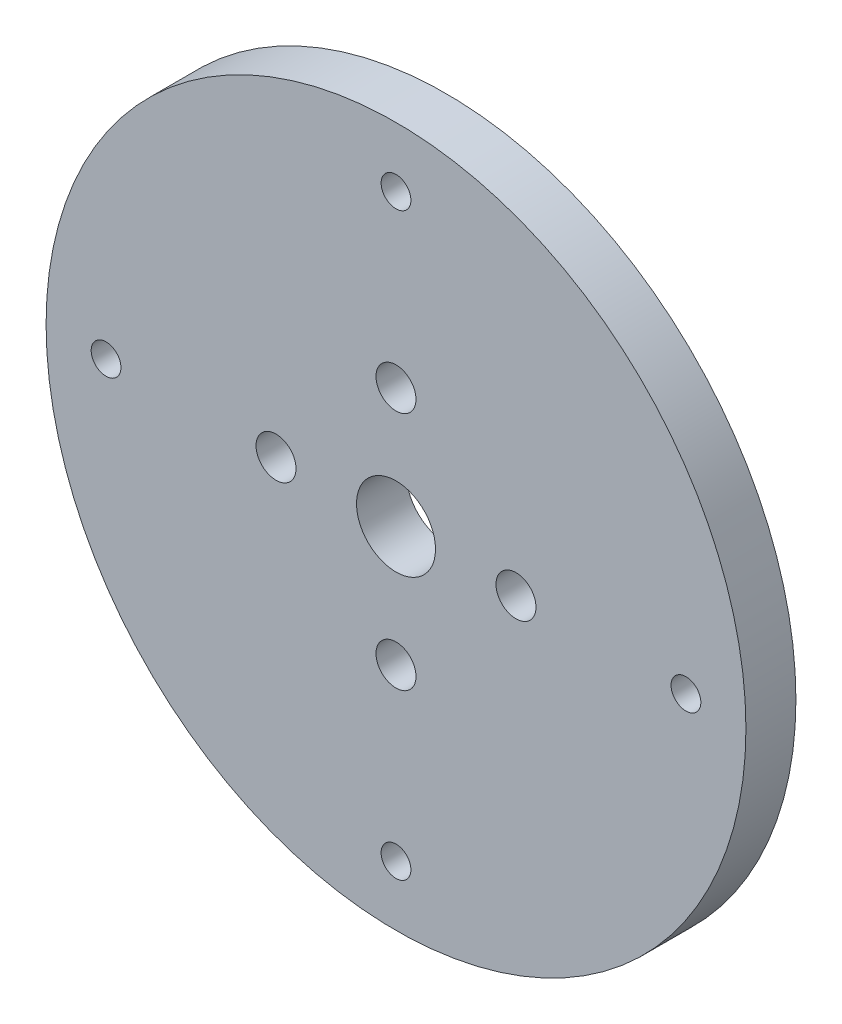
ISO-10303-21;
HEADER;
FILE_DESCRIPTION(('STEP AP214'),'2;1');
FILE_NAME('part.step','',(''),(''),'','','');
FILE_SCHEMA(('AUTOMOTIVE_DESIGN { 1 0 10303 214 1 1 1 1 }'));
ENDSEC;
DATA;
#1=APPLICATION_CONTEXT('core data for automotive mechanical design processes');
#2=APPLICATION_PROTOCOL_DEFINITION('international standard','automotive_design',2000,#1);
#3=PRODUCT_CONTEXT('',#1,'mechanical');
#4=PRODUCT('Part','Part','',(#3));
#5=PRODUCT_RELATED_PRODUCT_CATEGORY('part','',(#4));
#6=PRODUCT_DEFINITION_FORMATION('','',#4);
#7=PRODUCT_DEFINITION_CONTEXT('part definition',#1,'design');
#8=PRODUCT_DEFINITION('design','',#6,#7);
#9=PRODUCT_DEFINITION_SHAPE('','',#8);
#10=(LENGTH_UNIT() NAMED_UNIT(*) SI_UNIT(.MILLI.,.METRE.));
#11=(NAMED_UNIT(*) PLANE_ANGLE_UNIT() SI_UNIT($,.RADIAN.));
#12=(NAMED_UNIT(*) SI_UNIT($,.STERADIAN.) SOLID_ANGLE_UNIT());
#13=UNCERTAINTY_MEASURE_WITH_UNIT(LENGTH_MEASURE(1.E-05),#10,'distance_accuracy_value','');
#14=(GEOMETRIC_REPRESENTATION_CONTEXT(3) GLOBAL_UNCERTAINTY_ASSIGNED_CONTEXT((#13)) GLOBAL_UNIT_ASSIGNED_CONTEXT((#10,
#11,#12)) REPRESENTATION_CONTEXT('',''));
#15=CARTESIAN_POINT('',(0.,0.,0.));
#16=DIRECTION('',(0.,0.,1.));
#17=DIRECTION('',(1.,0.,0.));
#18=AXIS2_PLACEMENT_3D('',#15,#16,#17);
#19=CARTESIAN_POINT('',(0.,0.,5.));
#20=DIRECTION('',(0.,0.,1.));
#21=DIRECTION('',(1.,0.,0.));
#22=AXIS2_PLACEMENT_3D('',#19,#20,#21);
#23=PLANE('',#22);
#24=CARTESIAN_POINT('',(0.,-12.,5.));
#25=DIRECTION('',(0.,0.,1.));
#26=DIRECTION('',(1.,0.,0.));
#27=AXIS2_PLACEMENT_3D('',#24,#25,#26);
#28=CIRCLE('',#27,2.);
#29=CARTESIAN_POINT('',(2.,-12.,5.));
#30=VERTEX_POINT('',#29);
#31=EDGE_CURVE('E83',#30,#30,#28,.T.);
#32=ORIENTED_EDGE('',*,*,#31,.F.);
#33=EDGE_LOOP('',(#32));
#34=FACE_BOUND('',#33,.T.);
#35=CARTESIAN_POINT('',(0.,12.,5.));
#36=DIRECTION('',(0.,0.,1.));
#37=DIRECTION('',(1.,0.,0.));
#38=AXIS2_PLACEMENT_3D('',#35,#36,#37);
#39=CIRCLE('',#38,2.);
#40=CARTESIAN_POINT('',(2.,12.,5.));
#41=VERTEX_POINT('',#40);
#42=EDGE_CURVE('E71',#41,#41,#39,.T.);
#43=ORIENTED_EDGE('',*,*,#42,.F.);
#44=EDGE_LOOP('',(#43));
#45=FACE_BOUND('',#44,.T.);
#46=CARTESIAN_POINT('',(0.,29.,5.));
#47=DIRECTION('',(0.,0.,1.));
#48=DIRECTION('',(1.,0.,0.));
#49=AXIS2_PLACEMENT_3D('',#46,#47,#48);
#50=CIRCLE('',#49,1.49);
#51=CARTESIAN_POINT('',(1.49,29.,5.));
#52=VERTEX_POINT('',#51);
#53=EDGE_CURVE('E59',#52,#52,#50,.T.);
#54=ORIENTED_EDGE('',*,*,#53,.F.);
#55=EDGE_LOOP('',(#54));
#56=FACE_BOUND('',#55,.T.);
#57=CARTESIAN_POINT('',(0.,0.,5.));
#58=DIRECTION('',(0.,0.,1.));
#59=DIRECTION('',(1.,0.,0.));
#60=AXIS2_PLACEMENT_3D('',#57,#58,#59);
#61=CIRCLE('',#60,3.95);
#62=CARTESIAN_POINT('',(3.95,0.,5.));
#63=VERTEX_POINT('',#62);
#64=EDGE_CURVE('E47',#63,#63,#61,.T.);
#65=ORIENTED_EDGE('',*,*,#64,.F.);
#66=EDGE_LOOP('',(#65));
#67=FACE_BOUND('',#66,.T.);
#68=CARTESIAN_POINT('',(0.,0.,5.));
#69=DIRECTION('',(0.,0.,1.));
#70=DIRECTION('',(1.,0.,0.));
#71=AXIS2_PLACEMENT_3D('',#68,#69,#70);
#72=CIRCLE('',#71,35.);
#73=CARTESIAN_POINT('',(35.,0.,5.));
#74=VERTEX_POINT('',#73);
#75=EDGE_CURVE('E10',#74,#74,#72,.T.);
#76=ORIENTED_EDGE('',*,*,#75,.T.);
#77=EDGE_LOOP('',(#76));
#78=FACE_BOUND('',#77,.T.);
#79=CARTESIAN_POINT('',(-29.,0.,5.));
#80=DIRECTION('',(0.,0.,1.));
#81=DIRECTION('',(1.,0.,0.));
#82=AXIS2_PLACEMENT_3D('',#79,#80,#81);
#83=CIRCLE('',#82,1.49);
#84=CARTESIAN_POINT('',(-27.51,0.,5.));
#85=VERTEX_POINT('',#84);
#86=EDGE_CURVE('E42',#85,#85,#83,.T.);
#87=ORIENTED_EDGE('',*,*,#86,.F.);
#88=EDGE_LOOP('',(#87));
#89=FACE_BOUND('',#88,.T.);
#90=CARTESIAN_POINT('',(29.,0.,5.));
#91=DIRECTION('',(0.,0.,1.));
#92=DIRECTION('',(1.,0.,0.));
#93=AXIS2_PLACEMENT_3D('',#90,#91,#92);
#94=CIRCLE('',#93,1.49);
#95=CARTESIAN_POINT('',(30.49,0.,5.));
#96=VERTEX_POINT('',#95);
#97=EDGE_CURVE('E53',#96,#96,#94,.T.);
#98=ORIENTED_EDGE('',*,*,#97,.F.);
#99=EDGE_LOOP('',(#98));
#100=FACE_BOUND('',#99,.T.);
#101=CARTESIAN_POINT('',(0.,-29.,5.));
#102=DIRECTION('',(0.,0.,1.));
#103=DIRECTION('',(1.,0.,0.));
#104=AXIS2_PLACEMENT_3D('',#101,#102,#103);
#105=CIRCLE('',#104,1.49);
#106=CARTESIAN_POINT('',(1.49,-29.,5.));
#107=VERTEX_POINT('',#106);
#108=EDGE_CURVE('E65',#107,#107,#105,.T.);
#109=ORIENTED_EDGE('',*,*,#108,.F.);
#110=EDGE_LOOP('',(#109));
#111=FACE_BOUND('',#110,.T.);
#112=CARTESIAN_POINT('',(12.,0.,5.));
#113=DIRECTION('',(0.,0.,1.));
#114=DIRECTION('',(1.,0.,0.));
#115=AXIS2_PLACEMENT_3D('',#112,#113,#114);
#116=CIRCLE('',#115,2.);
#117=CARTESIAN_POINT('',(14.,0.,5.));
#118=VERTEX_POINT('',#117);
#119=EDGE_CURVE('E77',#118,#118,#116,.T.);
#120=ORIENTED_EDGE('',*,*,#119,.F.);
#121=EDGE_LOOP('',(#120));
#122=FACE_BOUND('',#121,.T.);
#123=CARTESIAN_POINT('',(-12.,0.,5.));
#124=DIRECTION('',(0.,0.,1.));
#125=DIRECTION('',(1.,0.,0.));
#126=AXIS2_PLACEMENT_3D('',#123,#124,#125);
#127=CIRCLE('',#126,2.);
#128=CARTESIAN_POINT('',(-10.,0.,5.));
#129=VERTEX_POINT('',#128);
#130=EDGE_CURVE('E89',#129,#129,#127,.T.);
#131=ORIENTED_EDGE('',*,*,#130,.F.);
#132=EDGE_LOOP('',(#131));
#133=FACE_BOUND('',#132,.T.);
#134=ADVANCED_FACE('F31',(#34,#45,#56,#67,#78,#89,#100,#111,#122,#133),#23,.T.);
#135=CARTESIAN_POINT('',(0.,0.,0.));
#136=DIRECTION('',(0.,0.,1.));
#137=DIRECTION('',(1.,0.,0.));
#138=AXIS2_PLACEMENT_3D('',#135,#136,#137);
#139=PLANE('',#138);
#140=CARTESIAN_POINT('',(0.,0.,0.));
#141=DIRECTION('',(0.,0.,1.));
#142=DIRECTION('',(1.,0.,0.));
#143=AXIS2_PLACEMENT_3D('',#140,#141,#142);
#144=CIRCLE('',#143,35.);
#145=CARTESIAN_POINT('',(35.,0.,0.));
#146=VERTEX_POINT('',#145);
#147=EDGE_CURVE('E35',#146,#146,#144,.T.);
#148=ORIENTED_EDGE('',*,*,#147,.F.);
#149=EDGE_LOOP('',(#148));
#150=FACE_BOUND('',#149,.T.);
#151=CARTESIAN_POINT('',(-29.,0.,0.));
#152=DIRECTION('',(0.,0.,1.));
#153=DIRECTION('',(1.,0.,0.));
#154=AXIS2_PLACEMENT_3D('',#151,#152,#153);
#155=CIRCLE('',#154,1.49);
#156=CARTESIAN_POINT('',(-27.51,0.,0.));
#157=VERTEX_POINT('',#156);
#158=EDGE_CURVE('E44',#157,#157,#155,.T.);
#159=ORIENTED_EDGE('',*,*,#158,.T.);
#160=EDGE_LOOP('',(#159));
#161=FACE_BOUND('',#160,.T.);
#162=CARTESIAN_POINT('',(0.,0.,0.));
#163=DIRECTION('',(0.,0.,1.));
#164=DIRECTION('',(1.,0.,0.));
#165=AXIS2_PLACEMENT_3D('',#162,#163,#164);
#166=CIRCLE('',#165,3.95);
#167=CARTESIAN_POINT('',(3.95,0.,0.));
#168=VERTEX_POINT('',#167);
#169=EDGE_CURVE('E50',#168,#168,#166,.T.);
#170=ORIENTED_EDGE('',*,*,#169,.T.);
#171=EDGE_LOOP('',(#170));
#172=FACE_BOUND('',#171,.T.);
#173=CARTESIAN_POINT('',(29.,0.,0.));
#174=DIRECTION('',(0.,0.,1.));
#175=DIRECTION('',(1.,0.,0.));
#176=AXIS2_PLACEMENT_3D('',#173,#174,#175);
#177=CIRCLE('',#176,1.49);
#178=CARTESIAN_POINT('',(30.49,0.,0.));
#179=VERTEX_POINT('',#178);
#180=EDGE_CURVE('E56',#179,#179,#177,.T.);
#181=ORIENTED_EDGE('',*,*,#180,.T.);
#182=EDGE_LOOP('',(#181));
#183=FACE_BOUND('',#182,.T.);
#184=CARTESIAN_POINT('',(0.,29.,0.));
#185=DIRECTION('',(0.,0.,1.));
#186=DIRECTION('',(1.,0.,0.));
#187=AXIS2_PLACEMENT_3D('',#184,#185,#186);
#188=CIRCLE('',#187,1.49);
#189=CARTESIAN_POINT('',(1.49,29.,0.));
#190=VERTEX_POINT('',#189);
#191=EDGE_CURVE('E62',#190,#190,#188,.T.);
#192=ORIENTED_EDGE('',*,*,#191,.T.);
#193=EDGE_LOOP('',(#192));
#194=FACE_BOUND('',#193,.T.);
#195=CARTESIAN_POINT('',(0.,-29.,0.));
#196=DIRECTION('',(0.,0.,1.));
#197=DIRECTION('',(1.,0.,0.));
#198=AXIS2_PLACEMENT_3D('',#195,#196,#197);
#199=CIRCLE('',#198,1.49);
#200=CARTESIAN_POINT('',(1.49,-29.,0.));
#201=VERTEX_POINT('',#200);
#202=EDGE_CURVE('E68',#201,#201,#199,.T.);
#203=ORIENTED_EDGE('',*,*,#202,.T.);
#204=EDGE_LOOP('',(#203));
#205=FACE_BOUND('',#204,.T.);
#206=CARTESIAN_POINT('',(0.,12.,0.));
#207=DIRECTION('',(0.,0.,1.));
#208=DIRECTION('',(1.,0.,0.));
#209=AXIS2_PLACEMENT_3D('',#206,#207,#208);
#210=CIRCLE('',#209,2.);
#211=CARTESIAN_POINT('',(2.,12.,0.));
#212=VERTEX_POINT('',#211);
#213=EDGE_CURVE('E74',#212,#212,#210,.T.);
#214=ORIENTED_EDGE('',*,*,#213,.T.);
#215=EDGE_LOOP('',(#214));
#216=FACE_BOUND('',#215,.T.);
#217=CARTESIAN_POINT('',(12.,0.,0.));
#218=DIRECTION('',(0.,0.,1.));
#219=DIRECTION('',(1.,0.,0.));
#220=AXIS2_PLACEMENT_3D('',#217,#218,#219);
#221=CIRCLE('',#220,2.);
#222=CARTESIAN_POINT('',(14.,0.,0.));
#223=VERTEX_POINT('',#222);
#224=EDGE_CURVE('E80',#223,#223,#221,.T.);
#225=ORIENTED_EDGE('',*,*,#224,.T.);
#226=EDGE_LOOP('',(#225));
#227=FACE_BOUND('',#226,.T.);
#228=CARTESIAN_POINT('',(0.,-12.,0.));
#229=DIRECTION('',(0.,0.,1.));
#230=DIRECTION('',(1.,0.,0.));
#231=AXIS2_PLACEMENT_3D('',#228,#229,#230);
#232=CIRCLE('',#231,2.);
#233=CARTESIAN_POINT('',(2.,-12.,0.));
#234=VERTEX_POINT('',#233);
#235=EDGE_CURVE('E86',#234,#234,#232,.T.);
#236=ORIENTED_EDGE('',*,*,#235,.T.);
#237=EDGE_LOOP('',(#236));
#238=FACE_BOUND('',#237,.T.);
#239=CARTESIAN_POINT('',(-12.,0.,0.));
#240=DIRECTION('',(0.,0.,1.));
#241=DIRECTION('',(1.,0.,0.));
#242=AXIS2_PLACEMENT_3D('',#239,#240,#241);
#243=CIRCLE('',#242,2.);
#244=CARTESIAN_POINT('',(-10.,0.,0.));
#245=VERTEX_POINT('',#244);
#246=EDGE_CURVE('E92',#245,#245,#243,.T.);
#247=ORIENTED_EDGE('',*,*,#246,.T.);
#248=EDGE_LOOP('',(#247));
#249=FACE_BOUND('',#248,.T.);
#250=ADVANCED_FACE('F102',(#150,#161,#172,#183,#194,#205,#216,#227,#238,#249),#139,.F.);
#251=CARTESIAN_POINT('',(0.,0.,5.));
#252=DIRECTION('',(0.,0.,-1.));
#253=DIRECTION('',(-1.,0.,0.));
#254=AXIS2_PLACEMENT_3D('',#251,#252,#253);
#255=CYLINDRICAL_SURFACE('',#254,35.);
#256=ORIENTED_EDGE('',*,*,#75,.F.);
#257=EDGE_LOOP('',(#256));
#258=FACE_BOUND('',#257,.T.);
#259=ORIENTED_EDGE('',*,*,#147,.T.);
#260=EDGE_LOOP('',(#259));
#261=FACE_BOUND('',#260,.T.);
#262=ADVANCED_FACE('F33',(#258,#261),#255,.T.);
#263=CARTESIAN_POINT('',(-29.,0.,5.));
#264=DIRECTION('',(0.,0.,-1.));
#265=DIRECTION('',(-1.,0.,0.));
#266=AXIS2_PLACEMENT_3D('',#263,#264,#265);
#267=CYLINDRICAL_SURFACE('',#266,1.49);
#268=ORIENTED_EDGE('',*,*,#86,.T.);
#269=EDGE_LOOP('',(#268));
#270=FACE_BOUND('',#269,.T.);
#271=ORIENTED_EDGE('',*,*,#158,.F.);
#272=EDGE_LOOP('',(#271));
#273=FACE_BOUND('',#272,.T.);
#274=ADVANCED_FACE('F112',(#270,#273),#267,.F.);
#275=CARTESIAN_POINT('',(0.,0.,5.));
#276=DIRECTION('',(0.,0.,-1.));
#277=DIRECTION('',(-1.,0.,0.));
#278=AXIS2_PLACEMENT_3D('',#275,#276,#277);
#279=CYLINDRICAL_SURFACE('',#278,3.95);
#280=ORIENTED_EDGE('',*,*,#64,.T.);
#281=EDGE_LOOP('',(#280));
#282=FACE_BOUND('',#281,.T.);
#283=ORIENTED_EDGE('',*,*,#169,.F.);
#284=EDGE_LOOP('',(#283));
#285=FACE_BOUND('',#284,.T.);
#286=ADVANCED_FACE('F115',(#282,#285),#279,.F.);
#287=CARTESIAN_POINT('',(29.,0.,5.));
#288=DIRECTION('',(0.,0.,-1.));
#289=DIRECTION('',(-1.,0.,0.));
#290=AXIS2_PLACEMENT_3D('',#287,#288,#289);
#291=CYLINDRICAL_SURFACE('',#290,1.49);
#292=ORIENTED_EDGE('',*,*,#97,.T.);
#293=EDGE_LOOP('',(#292));
#294=FACE_BOUND('',#293,.T.);
#295=ORIENTED_EDGE('',*,*,#180,.F.);
#296=EDGE_LOOP('',(#295));
#297=FACE_BOUND('',#296,.T.);
#298=ADVANCED_FACE('F119',(#294,#297),#291,.F.);
#299=CARTESIAN_POINT('',(0.,29.,5.));
#300=DIRECTION('',(0.,0.,-1.));
#301=DIRECTION('',(-1.,0.,0.));
#302=AXIS2_PLACEMENT_3D('',#299,#300,#301);
#303=CYLINDRICAL_SURFACE('',#302,1.49);
#304=ORIENTED_EDGE('',*,*,#53,.T.);
#305=EDGE_LOOP('',(#304));
#306=FACE_BOUND('',#305,.T.);
#307=ORIENTED_EDGE('',*,*,#191,.F.);
#308=EDGE_LOOP('',(#307));
#309=FACE_BOUND('',#308,.T.);
#310=ADVANCED_FACE('F123',(#306,#309),#303,.F.);
#311=CARTESIAN_POINT('',(0.,-29.,5.));
#312=DIRECTION('',(0.,0.,-1.));
#313=DIRECTION('',(-1.,0.,0.));
#314=AXIS2_PLACEMENT_3D('',#311,#312,#313);
#315=CYLINDRICAL_SURFACE('',#314,1.49);
#316=ORIENTED_EDGE('',*,*,#108,.T.);
#317=EDGE_LOOP('',(#316));
#318=FACE_BOUND('',#317,.T.);
#319=ORIENTED_EDGE('',*,*,#202,.F.);
#320=EDGE_LOOP('',(#319));
#321=FACE_BOUND('',#320,.T.);
#322=ADVANCED_FACE('F127',(#318,#321),#315,.F.);
#323=CARTESIAN_POINT('',(0.,12.,5.));
#324=DIRECTION('',(0.,0.,-1.));
#325=DIRECTION('',(-1.,0.,0.));
#326=AXIS2_PLACEMENT_3D('',#323,#324,#325);
#327=CYLINDRICAL_SURFACE('',#326,2.);
#328=ORIENTED_EDGE('',*,*,#42,.T.);
#329=EDGE_LOOP('',(#328));
#330=FACE_BOUND('',#329,.T.);
#331=ORIENTED_EDGE('',*,*,#213,.F.);
#332=EDGE_LOOP('',(#331));
#333=FACE_BOUND('',#332,.T.);
#334=ADVANCED_FACE('F131',(#330,#333),#327,.F.);
#335=CARTESIAN_POINT('',(12.,0.,5.));
#336=DIRECTION('',(0.,0.,-1.));
#337=DIRECTION('',(-1.,0.,0.));
#338=AXIS2_PLACEMENT_3D('',#335,#336,#337);
#339=CYLINDRICAL_SURFACE('',#338,2.);
#340=ORIENTED_EDGE('',*,*,#119,.T.);
#341=EDGE_LOOP('',(#340));
#342=FACE_BOUND('',#341,.T.);
#343=ORIENTED_EDGE('',*,*,#224,.F.);
#344=EDGE_LOOP('',(#343));
#345=FACE_BOUND('',#344,.T.);
#346=ADVANCED_FACE('F135',(#342,#345),#339,.F.);
#347=CARTESIAN_POINT('',(0.,-12.,5.));
#348=DIRECTION('',(0.,0.,-1.));
#349=DIRECTION('',(-1.,0.,0.));
#350=AXIS2_PLACEMENT_3D('',#347,#348,#349);
#351=CYLINDRICAL_SURFACE('',#350,2.);
#352=ORIENTED_EDGE('',*,*,#31,.T.);
#353=EDGE_LOOP('',(#352));
#354=FACE_BOUND('',#353,.T.);
#355=ORIENTED_EDGE('',*,*,#235,.F.);
#356=EDGE_LOOP('',(#355));
#357=FACE_BOUND('',#356,.T.);
#358=ADVANCED_FACE('F139',(#354,#357),#351,.F.);
#359=CARTESIAN_POINT('',(-12.,0.,5.));
#360=DIRECTION('',(0.,0.,-1.));
#361=DIRECTION('',(-1.,0.,0.));
#362=AXIS2_PLACEMENT_3D('',#359,#360,#361);
#363=CYLINDRICAL_SURFACE('',#362,2.);
#364=ORIENTED_EDGE('',*,*,#130,.T.);
#365=EDGE_LOOP('',(#364));
#366=FACE_BOUND('',#365,.T.);
#367=ORIENTED_EDGE('',*,*,#246,.F.);
#368=EDGE_LOOP('',(#367));
#369=FACE_BOUND('',#368,.T.);
#370=ADVANCED_FACE('F98',(#366,#369),#363,.F.);
#371=CLOSED_SHELL('',(#134,#250,#262,#274,#286,#298,#310,#322,#334,#346,#358,#370));
#372=MANIFOLD_SOLID_BREP('B2',#371);
#373=ADVANCED_BREP_SHAPE_REPRESENTATION('',(#18,#372),#14);
#374=SHAPE_DEFINITION_REPRESENTATION(#9,#373);
ENDSEC;
END-ISO-10303-21;
